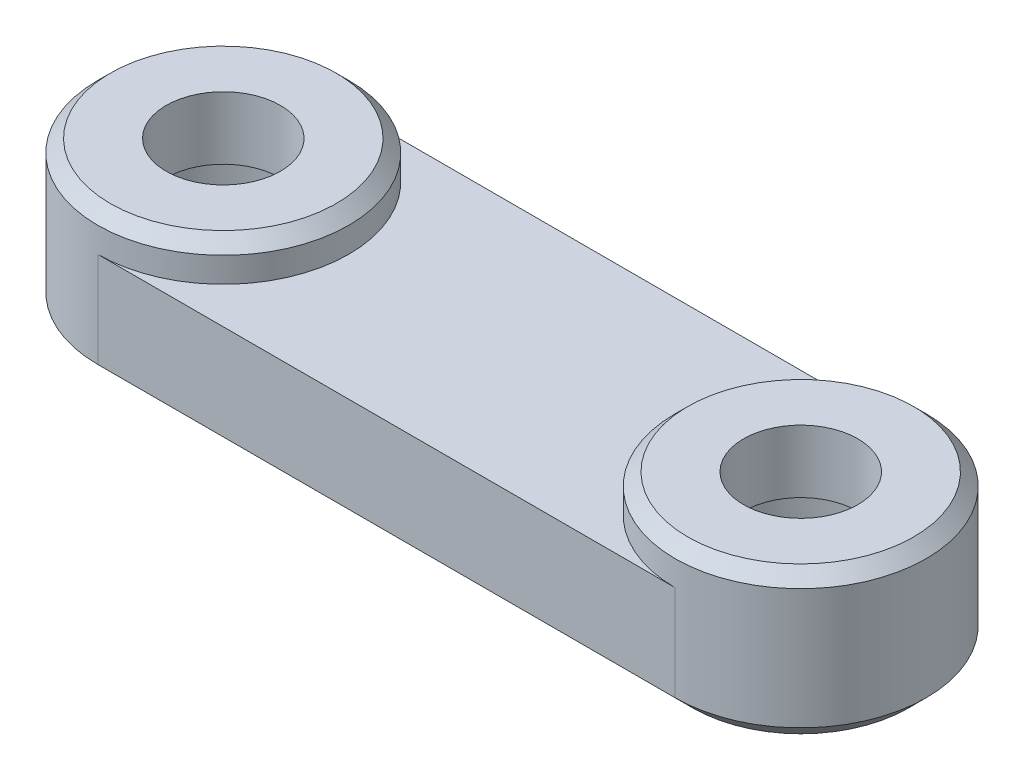
ISO-10303-21;
HEADER;
FILE_DESCRIPTION(('STEP AP214'),'2;1');
FILE_NAME('part.step','',(''),(''),'','','');
FILE_SCHEMA(('AUTOMOTIVE_DESIGN { 1 0 10303 214 1 1 1 1 }'));
ENDSEC;
DATA;
#1=APPLICATION_CONTEXT('core data for automotive mechanical design processes');
#2=APPLICATION_PROTOCOL_DEFINITION('international standard','automotive_design',2000,#1);
#3=PRODUCT_CONTEXT('',#1,'mechanical');
#4=PRODUCT('Part','Part','',(#3));
#5=PRODUCT_RELATED_PRODUCT_CATEGORY('part','',(#4));
#6=PRODUCT_DEFINITION_FORMATION('','',#4);
#7=PRODUCT_DEFINITION_CONTEXT('part definition',#1,'design');
#8=PRODUCT_DEFINITION('design','',#6,#7);
#9=PRODUCT_DEFINITION_SHAPE('','',#8);
#10=(LENGTH_UNIT() NAMED_UNIT(*) SI_UNIT(.MILLI.,.METRE.));
#11=(NAMED_UNIT(*) PLANE_ANGLE_UNIT() SI_UNIT($,.RADIAN.));
#12=(NAMED_UNIT(*) SI_UNIT($,.STERADIAN.) SOLID_ANGLE_UNIT());
#13=UNCERTAINTY_MEASURE_WITH_UNIT(LENGTH_MEASURE(1.E-05),#10,'distance_accuracy_value','');
#14=(GEOMETRIC_REPRESENTATION_CONTEXT(3) GLOBAL_UNCERTAINTY_ASSIGNED_CONTEXT((#13)) GLOBAL_UNIT_ASSIGNED_CONTEXT((#10,
#11,#12)) REPRESENTATION_CONTEXT('',''));
#15=CARTESIAN_POINT('',(0.,0.,0.));
#16=DIRECTION('',(0.,0.,1.));
#17=DIRECTION('',(1.,0.,0.));
#18=AXIS2_PLACEMENT_3D('',#15,#16,#17);
#19=CARTESIAN_POINT('',(0.,6.,0.));
#20=DIRECTION('',(0.,1.,0.));
#21=DIRECTION('',(0.,0.,1.));
#22=AXIS2_PLACEMENT_3D('',#19,#20,#21);
#23=PLANE('',#22);
#24=CARTESIAN_POINT('',(23.,6.,0.));
#25=DIRECTION('',(0.,1.,0.));
#26=DIRECTION('',(0.,0.,1.));
#27=AXIS2_PLACEMENT_3D('',#24,#25,#26);
#28=CIRCLE('',#27,4.5);
#29=CARTESIAN_POINT('',(23.,6.,4.5));
#30=VERTEX_POINT('',#29);
#31=EDGE_CURVE('E133',#30,#30,#28,.T.);
#32=ORIENTED_EDGE('',*,*,#31,.T.);
#33=EDGE_LOOP('',(#32));
#34=FACE_BOUND('',#33,.T.);
#35=CARTESIAN_POINT('',(23.,6.,0.));
#36=DIRECTION('',(0.,-1.,0.));
#37=DIRECTION('',(0.,0.,-1.));
#38=AXIS2_PLACEMENT_3D('',#35,#36,#37);
#39=CIRCLE('',#38,2.275);
#40=CARTESIAN_POINT('',(23.,6.,-2.275));
#41=VERTEX_POINT('',#40);
#42=EDGE_CURVE('E113',#41,#41,#39,.T.);
#43=ORIENTED_EDGE('',*,*,#42,.T.);
#44=EDGE_LOOP('',(#43));
#45=FACE_BOUND('',#44,.T.);
#46=ADVANCED_FACE('F41',(#34,#45),#23,.T.);
#47=CARTESIAN_POINT('',(0.,6.,0.));
#48=DIRECTION('',(0.,1.,0.));
#49=DIRECTION('',(0.,0.,1.));
#50=AXIS2_PLACEMENT_3D('',#47,#48,#49);
#51=CIRCLE('',#50,4.5);
#52=CARTESIAN_POINT('',(0.,6.,4.5));
#53=VERTEX_POINT('',#52);
#54=EDGE_CURVE('E120',#53,#53,#51,.T.);
#55=ORIENTED_EDGE('',*,*,#54,.T.);
#56=EDGE_LOOP('',(#55));
#57=FACE_BOUND('',#56,.T.);
#58=CARTESIAN_POINT('',(0.,6.,0.));
#59=DIRECTION('',(0.,-1.,0.));
#60=DIRECTION('',(0.,0.,-1.));
#61=AXIS2_PLACEMENT_3D('',#58,#59,#60);
#62=CIRCLE('',#61,2.275);
#63=CARTESIAN_POINT('',(0.,6.,-2.275));
#64=VERTEX_POINT('',#63);
#65=EDGE_CURVE('E213',#64,#64,#62,.T.);
#66=ORIENTED_EDGE('',*,*,#65,.T.);
#67=EDGE_LOOP('',(#66));
#68=FACE_BOUND('',#67,.T.);
#69=ADVANCED_FACE('F245',(#57,#68),#23,.T.);
#70=CARTESIAN_POINT('',(0.,6.,0.));
#71=DIRECTION('',(0.,-1.,0.));
#72=DIRECTION('',(0.,0.,-1.));
#73=AXIS2_PLACEMENT_3D('',#70,#71,#72);
#74=CYLINDRICAL_SURFACE('',#73,5.);
#75=CARTESIAN_POINT('',(0.,5.49999999999999,0.));
#76=DIRECTION('',(0.,1.,0.));
#77=DIRECTION('',(0.,0.,1.));
#78=AXIS2_PLACEMENT_3D('',#75,#76,#77);
#79=CIRCLE('',#78,5.);
#80=CARTESIAN_POINT('',(0.,5.49999999999999,5.));
#81=VERTEX_POINT('',#80);
#82=EDGE_CURVE('E129',#81,#81,#79,.F.);
#83=ORIENTED_EDGE('',*,*,#82,.T.);
#84=EDGE_LOOP('',(#83));
#85=FACE_BOUND('',#84,.T.);
#86=DIRECTION('',(0.,-1.,0.));
#87=VECTOR('',#86,1.);
#88=CARTESIAN_POINT('',(0.,6.,-5.));
#89=LINE('',#88,#87);
#90=CARTESIAN_POINT('',(0.,4.5,-5.00000000000926));
#91=VERTEX_POINT('',#90);
#92=CARTESIAN_POINT('',(0.,0.699999999999999,-5.));
#93=VERTEX_POINT('',#92);
#94=EDGE_CURVE('E195',#91,#93,#89,.T.);
#95=ORIENTED_EDGE('',*,*,#94,.T.);
#96=CARTESIAN_POINT('',(0.,0.699999999999999,0.));
#97=DIRECTION('',(0.,1.,0.));
#98=DIRECTION('',(0.,0.,1.));
#99=AXIS2_PLACEMENT_3D('',#96,#97,#98);
#100=CIRCLE('',#99,5.);
#101=CARTESIAN_POINT('',(0.,0.699999999999999,5.));
#102=VERTEX_POINT('',#101);
#103=EDGE_CURVE('E66',#93,#102,#100,.T.);
#104=ORIENTED_EDGE('',*,*,#103,.T.);
#105=DIRECTION('',(0.,-1.,0.));
#106=VECTOR('',#105,1.);
#107=CARTESIAN_POINT('',(0.,6.,5.));
#108=LINE('',#107,#106);
#109=CARTESIAN_POINT('',(0.,4.5,5.00000000000921));
#110=VERTEX_POINT('',#109);
#111=EDGE_CURVE('E110',#110,#102,#108,.T.);
#112=ORIENTED_EDGE('',*,*,#111,.F.);
#113=CARTESIAN_POINT('',(0.,4.5,0.));
#114=DIRECTION('',(0.,1.,0.));
#115=DIRECTION('',(0.,0.,1.));
#116=AXIS2_PLACEMENT_3D('',#113,#114,#115);
#117=CIRCLE('',#116,5.00000000000924);
#118=EDGE_CURVE('E98',#110,#91,#117,.T.);
#119=ORIENTED_EDGE('',*,*,#118,.T.);
#120=EDGE_LOOP('',(#95,#104,#112,#119));
#121=FACE_BOUND('',#120,.T.);
#122=ADVANCED_FACE('F115',(#85,#121),#74,.T.);
#123=CARTESIAN_POINT('',(0.,6.,5.));
#124=DIRECTION('',(0.,0.,-1.));
#125=DIRECTION('',(-1.,0.,0.));
#126=AXIS2_PLACEMENT_3D('',#123,#124,#125);
#127=PLANE('',#126);
#128=ORIENTED_EDGE('',*,*,#111,.T.);
#129=DIRECTION('',(1.,0.,0.));
#130=VECTOR('',#129,1.);
#131=CARTESIAN_POINT('',(0.,0.699999999999999,5.));
#132=LINE('',#131,#130);
#133=CARTESIAN_POINT('',(23.,0.699999999999999,5.));
#134=VERTEX_POINT('',#133);
#135=EDGE_CURVE('E11',#102,#134,#132,.T.);
#136=ORIENTED_EDGE('',*,*,#135,.T.);
#137=DIRECTION('',(0.,-1.,0.));
#138=VECTOR('',#137,1.);
#139=CARTESIAN_POINT('',(23.,6.,5.));
#140=LINE('',#139,#138);
#141=CARTESIAN_POINT('',(23.,4.5,4.99999999999672));
#142=VERTEX_POINT('',#141);
#143=EDGE_CURVE('E111',#142,#134,#140,.T.);
#144=ORIENTED_EDGE('',*,*,#143,.F.);
#145=DIRECTION('',(-1.,0.,0.));
#146=VECTOR('',#145,1.);
#147=CARTESIAN_POINT('',(0.,4.5,5.));
#148=LINE('',#147,#146);
#149=EDGE_CURVE('E101',#142,#110,#148,.T.);
#150=ORIENTED_EDGE('',*,*,#149,.T.);
#151=EDGE_LOOP('',(#128,#136,#144,#150));
#152=FACE_BOUND('',#151,.T.);
#153=ADVANCED_FACE('F109',(#152),#127,.F.);
#154=CARTESIAN_POINT('',(23.,6.,0.));
#155=DIRECTION('',(0.,-1.,0.));
#156=DIRECTION('',(0.,0.,-1.));
#157=AXIS2_PLACEMENT_3D('',#154,#155,#156);
#158=CYLINDRICAL_SURFACE('',#157,5.);
#159=CARTESIAN_POINT('',(23.,5.49999999999999,0.));
#160=DIRECTION('',(0.,1.,0.));
#161=DIRECTION('',(0.,0.,1.));
#162=AXIS2_PLACEMENT_3D('',#159,#160,#161);
#163=CIRCLE('',#162,5.);
#164=CARTESIAN_POINT('',(23.,5.49999999999999,5.));
#165=VERTEX_POINT('',#164);
#166=EDGE_CURVE('E137',#165,#165,#163,.F.);
#167=ORIENTED_EDGE('',*,*,#166,.T.);
#168=EDGE_LOOP('',(#167));
#169=FACE_BOUND('',#168,.T.);
#170=ORIENTED_EDGE('',*,*,#143,.T.);
#171=CARTESIAN_POINT('',(23.,0.699999999999999,0.));
#172=DIRECTION('',(0.,1.,0.));
#173=DIRECTION('',(0.,0.,1.));
#174=AXIS2_PLACEMENT_3D('',#171,#172,#173);
#175=CIRCLE('',#174,5.);
#176=CARTESIAN_POINT('',(23.,0.699999999999999,-5.));
#177=VERTEX_POINT('',#176);
#178=EDGE_CURVE('E52',#134,#177,#175,.T.);
#179=ORIENTED_EDGE('',*,*,#178,.T.);
#180=DIRECTION('',(0.,-1.,0.));
#181=VECTOR('',#180,1.);
#182=CARTESIAN_POINT('',(23.,6.,-5.));
#183=LINE('',#182,#181);
#184=CARTESIAN_POINT('',(23.,4.5,-4.99999999999672));
#185=VERTEX_POINT('',#184);
#186=EDGE_CURVE('E122',#185,#177,#183,.T.);
#187=ORIENTED_EDGE('',*,*,#186,.F.);
#188=CARTESIAN_POINT('',(23.,4.5,0.));
#189=DIRECTION('',(0.,1.,0.));
#190=DIRECTION('',(0.,0.,1.));
#191=AXIS2_PLACEMENT_3D('',#188,#189,#190);
#192=CIRCLE('',#191,4.99999999999672);
#193=EDGE_CURVE('E107',#185,#142,#192,.T.);
#194=ORIENTED_EDGE('',*,*,#193,.T.);
#195=EDGE_LOOP('',(#170,#179,#187,#194));
#196=FACE_BOUND('',#195,.T.);
#197=ADVANCED_FACE('F234',(#169,#196),#158,.T.);
#198=CARTESIAN_POINT('',(0.,6.,-5.));
#199=DIRECTION('',(0.,0.,1.));
#200=DIRECTION('',(1.,0.,0.));
#201=AXIS2_PLACEMENT_3D('',#198,#199,#200);
#202=PLANE('',#201);
#203=ORIENTED_EDGE('',*,*,#186,.T.);
#204=DIRECTION('',(-1.,0.,0.));
#205=VECTOR('',#204,1.);
#206=CARTESIAN_POINT('',(0.,0.699999999999999,-5.));
#207=LINE('',#206,#205);
#208=EDGE_CURVE('E141',#177,#93,#207,.T.);
#209=ORIENTED_EDGE('',*,*,#208,.T.);
#210=ORIENTED_EDGE('',*,*,#94,.F.);
#211=DIRECTION('',(1.,0.,0.));
#212=VECTOR('',#211,1.);
#213=CARTESIAN_POINT('',(0.,4.5,-5.));
#214=LINE('',#213,#212);
#215=EDGE_CURVE('E104',#91,#185,#214,.T.);
#216=ORIENTED_EDGE('',*,*,#215,.T.);
#217=EDGE_LOOP('',(#203,#209,#210,#216));
#218=FACE_BOUND('',#217,.T.);
#219=ADVANCED_FACE('F194',(#218),#202,.F.);
#220=CARTESIAN_POINT('',(0.,0.,0.));
#221=DIRECTION('',(0.,1.,0.));
#222=DIRECTION('',(0.,0.,1.));
#223=AXIS2_PLACEMENT_3D('',#220,#221,#222);
#224=PLANE('',#223);
#225=CARTESIAN_POINT('',(0.,0.,0.));
#226=DIRECTION('',(0.,1.,0.));
#227=DIRECTION('',(0.,0.,1.));
#228=AXIS2_PLACEMENT_3D('',#225,#226,#227);
#229=CIRCLE('',#228,4.29999999999999);
#230=CARTESIAN_POINT('',(0.,0.,4.29999999999999));
#231=VERTEX_POINT('',#230);
#232=CARTESIAN_POINT('',(0.,0.,-4.29999999999999));
#233=VERTEX_POINT('',#232);
#234=EDGE_CURVE('E151',#231,#233,#229,.F.);
#235=ORIENTED_EDGE('',*,*,#234,.T.);
#236=DIRECTION('',(1.,0.,0.));
#237=VECTOR('',#236,1.);
#238=CARTESIAN_POINT('',(0.,0.,-4.29999999999999));
#239=LINE('',#238,#237);
#240=CARTESIAN_POINT('',(23.,0.,-4.29999999999999));
#241=VERTEX_POINT('',#240);
#242=EDGE_CURVE('E154',#233,#241,#239,.T.);
#243=ORIENTED_EDGE('',*,*,#242,.T.);
#244=CARTESIAN_POINT('',(23.,0.,0.));
#245=DIRECTION('',(0.,1.,0.));
#246=DIRECTION('',(0.,0.,1.));
#247=AXIS2_PLACEMENT_3D('',#244,#245,#246);
#248=CIRCLE('',#247,4.29999999999999);
#249=CARTESIAN_POINT('',(23.,0.,4.29999999999999));
#250=VERTEX_POINT('',#249);
#251=EDGE_CURVE('E148',#241,#250,#248,.F.);
#252=ORIENTED_EDGE('',*,*,#251,.T.);
#253=DIRECTION('',(-1.,0.,0.));
#254=VECTOR('',#253,1.);
#255=CARTESIAN_POINT('',(0.,0.,4.29999999999999));
#256=LINE('',#255,#254);
#257=EDGE_CURVE('E145',#250,#231,#256,.T.);
#258=ORIENTED_EDGE('',*,*,#257,.T.);
#259=EDGE_LOOP('',(#235,#243,#252,#258));
#260=FACE_BOUND('',#259,.T.);
#261=CARTESIAN_POINT('',(23.,0.,0.));
#262=DIRECTION('',(0.,-1.,0.));
#263=DIRECTION('',(0.,0.,-1.));
#264=AXIS2_PLACEMENT_3D('',#261,#262,#263);
#265=CIRCLE('',#264,4.);
#266=CARTESIAN_POINT('',(23.,0.,-4.));
#267=VERTEX_POINT('',#266);
#268=EDGE_CURVE('E217',#267,#267,#265,.T.);
#269=ORIENTED_EDGE('',*,*,#268,.F.);
#270=EDGE_LOOP('',(#269));
#271=FACE_BOUND('',#270,.T.);
#272=CARTESIAN_POINT('',(0.,0.,0.));
#273=DIRECTION('',(0.,-1.,0.));
#274=DIRECTION('',(0.,0.,-1.));
#275=AXIS2_PLACEMENT_3D('',#272,#273,#274);
#276=CIRCLE('',#275,4.);
#277=CARTESIAN_POINT('',(0.,0.,-4.));
#278=VERTEX_POINT('',#277);
#279=EDGE_CURVE('E198',#278,#278,#276,.T.);
#280=ORIENTED_EDGE('',*,*,#279,.F.);
#281=EDGE_LOOP('',(#280));
#282=FACE_BOUND('',#281,.T.);
#283=ADVANCED_FACE('F184',(#260,#271,#282),#224,.F.);
#284=CARTESIAN_POINT('',(0.,0.,0.));
#285=DIRECTION('',(0.,-1.,0.));
#286=DIRECTION('',(0.,0.,-1.));
#287=AXIS2_PLACEMENT_3D('',#284,#285,#286);
#288=CYLINDRICAL_SURFACE('',#287,4.);
#289=ORIENTED_EDGE('',*,*,#279,.T.);
#290=EDGE_LOOP('',(#289));
#291=FACE_BOUND('',#290,.T.);
#292=CARTESIAN_POINT('',(0.,3.5,0.));
#293=DIRECTION('',(0.,-1.,0.));
#294=DIRECTION('',(0.,0.,-1.));
#295=AXIS2_PLACEMENT_3D('',#292,#293,#294);
#296=CIRCLE('',#295,4.);
#297=CARTESIAN_POINT('',(0.,3.5,-4.));
#298=VERTEX_POINT('',#297);
#299=EDGE_CURVE('E203',#298,#298,#296,.T.);
#300=ORIENTED_EDGE('',*,*,#299,.F.);
#301=EDGE_LOOP('',(#300));
#302=FACE_BOUND('',#301,.T.);
#303=ADVANCED_FACE('F255',(#291,#302),#288,.F.);
#304=CARTESIAN_POINT('',(-4.,3.5,0.));
#305=DIRECTION('',(0.,-1.,0.));
#306=DIRECTION('',(0.,0.,-1.));
#307=AXIS2_PLACEMENT_3D('',#304,#305,#306);
#308=PLANE('',#307);
#309=ORIENTED_EDGE('',*,*,#299,.T.);
#310=EDGE_LOOP('',(#309));
#311=FACE_BOUND('',#310,.T.);
#312=CARTESIAN_POINT('',(0.,3.5,0.));
#313=DIRECTION('',(0.,-1.,0.));
#314=DIRECTION('',(0.,0.,-1.));
#315=AXIS2_PLACEMENT_3D('',#312,#313,#314);
#316=CIRCLE('',#315,2.275);
#317=CARTESIAN_POINT('',(0.,3.5,-2.275));
#318=VERTEX_POINT('',#317);
#319=EDGE_CURVE('E209',#318,#318,#316,.T.);
#320=ORIENTED_EDGE('',*,*,#319,.F.);
#321=EDGE_LOOP('',(#320));
#322=FACE_BOUND('',#321,.T.);
#323=ADVANCED_FACE('F261',(#311,#322),#308,.T.);
#324=CARTESIAN_POINT('',(0.,0.,0.));
#325=DIRECTION('',(0.,-1.,0.));
#326=DIRECTION('',(0.,0.,-1.));
#327=AXIS2_PLACEMENT_3D('',#324,#325,#326);
#328=CYLINDRICAL_SURFACE('',#327,2.275);
#329=ORIENTED_EDGE('',*,*,#319,.T.);
#330=EDGE_LOOP('',(#329));
#331=FACE_BOUND('',#330,.T.);
#332=ORIENTED_EDGE('',*,*,#65,.F.);
#333=EDGE_LOOP('',(#332));
#334=FACE_BOUND('',#333,.T.);
#335=ADVANCED_FACE('F266',(#331,#334),#328,.F.);
#336=CARTESIAN_POINT('',(23.,0.,0.));
#337=DIRECTION('',(0.,-1.,0.));
#338=DIRECTION('',(0.,0.,-1.));
#339=AXIS2_PLACEMENT_3D('',#336,#337,#338);
#340=CYLINDRICAL_SURFACE('',#339,4.);
#341=ORIENTED_EDGE('',*,*,#268,.T.);
#342=EDGE_LOOP('',(#341));
#343=FACE_BOUND('',#342,.T.);
#344=CARTESIAN_POINT('',(23.,3.5,0.));
#345=DIRECTION('',(0.,-1.,0.));
#346=DIRECTION('',(0.,0.,-1.));
#347=AXIS2_PLACEMENT_3D('',#344,#345,#346);
#348=CIRCLE('',#347,4.);
#349=CARTESIAN_POINT('',(23.,3.5,-4.));
#350=VERTEX_POINT('',#349);
#351=EDGE_CURVE('E221',#350,#350,#348,.T.);
#352=ORIENTED_EDGE('',*,*,#351,.F.);
#353=EDGE_LOOP('',(#352));
#354=FACE_BOUND('',#353,.T.);
#355=ADVANCED_FACE('F276',(#343,#354),#340,.F.);
#356=CARTESIAN_POINT('',(19.,3.5,0.));
#357=DIRECTION('',(0.,-1.,0.));
#358=DIRECTION('',(0.,0.,-1.));
#359=AXIS2_PLACEMENT_3D('',#356,#357,#358);
#360=PLANE('',#359);
#361=ORIENTED_EDGE('',*,*,#351,.T.);
#362=EDGE_LOOP('',(#361));
#363=FACE_BOUND('',#362,.T.);
#364=CARTESIAN_POINT('',(23.,3.5,0.));
#365=DIRECTION('',(0.,-1.,0.));
#366=DIRECTION('',(0.,0.,-1.));
#367=AXIS2_PLACEMENT_3D('',#364,#365,#366);
#368=CIRCLE('',#367,2.275);
#369=CARTESIAN_POINT('',(23.,3.5,-2.275));
#370=VERTEX_POINT('',#369);
#371=EDGE_CURVE('E225',#370,#370,#368,.T.);
#372=ORIENTED_EDGE('',*,*,#371,.F.);
#373=EDGE_LOOP('',(#372));
#374=FACE_BOUND('',#373,.T.);
#375=ADVANCED_FACE('F283',(#363,#374),#360,.T.);
#376=CARTESIAN_POINT('',(23.,0.,0.));
#377=DIRECTION('',(0.,-1.,0.));
#378=DIRECTION('',(0.,0.,-1.));
#379=AXIS2_PLACEMENT_3D('',#376,#377,#378);
#380=CYLINDRICAL_SURFACE('',#379,2.275);
#381=ORIENTED_EDGE('',*,*,#371,.T.);
#382=EDGE_LOOP('',(#381));
#383=FACE_BOUND('',#382,.T.);
#384=ORIENTED_EDGE('',*,*,#42,.F.);
#385=EDGE_LOOP('',(#384));
#386=FACE_BOUND('',#385,.T.);
#387=ADVANCED_FACE('F289',(#383,#386),#380,.F.);
#388=CARTESIAN_POINT('',(0.,4.5,0.));
#389=DIRECTION('',(0.,-1.,0.));
#390=DIRECTION('',(0.,0.,-1.));
#391=AXIS2_PLACEMENT_3D('',#388,#389,#390);
#392=PLANE('',#391);
#393=ORIENTED_EDGE('',*,*,#193,.F.);
#394=ORIENTED_EDGE('',*,*,#215,.F.);
#395=ORIENTED_EDGE('',*,*,#118,.F.);
#396=ORIENTED_EDGE('',*,*,#149,.F.);
#397=EDGE_LOOP('',(#393,#394,#395,#396));
#398=FACE_BOUND('',#397,.T.);
#399=ADVANCED_FACE('F100',(#398),#392,.F.);
#400=CARTESIAN_POINT('',(0.,6.,0.));
#401=DIRECTION('',(0.,-1.,0.));
#402=DIRECTION('',(0.,0.,-1.));
#403=AXIS2_PLACEMENT_3D('',#400,#401,#402);
#404=CONICAL_SURFACE('',#403,4.5,0.785398163397445);
#405=ORIENTED_EDGE('',*,*,#82,.F.);
#406=EDGE_LOOP('',(#405));
#407=FACE_BOUND('',#406,.T.);
#408=ORIENTED_EDGE('',*,*,#54,.F.);
#409=EDGE_LOOP('',(#408));
#410=FACE_BOUND('',#409,.T.);
#411=ADVANCED_FACE('F295',(#407,#410),#404,.T.);
#412=CARTESIAN_POINT('',(23.,6.,0.));
#413=DIRECTION('',(0.,-1.,0.));
#414=DIRECTION('',(0.,0.,-1.));
#415=AXIS2_PLACEMENT_3D('',#412,#413,#414);
#416=CONICAL_SURFACE('',#415,4.5,0.785398163397445);
#417=ORIENTED_EDGE('',*,*,#166,.F.);
#418=EDGE_LOOP('',(#417));
#419=FACE_BOUND('',#418,.T.);
#420=ORIENTED_EDGE('',*,*,#31,.F.);
#421=EDGE_LOOP('',(#420));
#422=FACE_BOUND('',#421,.T.);
#423=ADVANCED_FACE('F299',(#419,#422),#416,.T.);
#424=CARTESIAN_POINT('',(0.,0.699999999999999,5.));
#425=DIRECTION('',(0.,0.707106781186551,-0.707106781186544));
#426=DIRECTION('',(1.,0.,0.));
#427=AXIS2_PLACEMENT_3D('',#424,#425,#426);
#428=PLANE('',#427);
#429=DIRECTION('',(0.,0.707106781186544,0.707106781186551));
#430=VECTOR('',#429,1.);
#431=CARTESIAN_POINT('',(0.,0.,4.29999999999999));
#432=LINE('',#431,#430);
#433=EDGE_CURVE('E167',#231,#102,#432,.T.);
#434=ORIENTED_EDGE('',*,*,#433,.F.);
#435=ORIENTED_EDGE('',*,*,#257,.F.);
#436=DIRECTION('',(0.,-0.707106781186544,-0.707106781186551));
#437=VECTOR('',#436,1.);
#438=CARTESIAN_POINT('',(23.,0.699999999999999,5.));
#439=LINE('',#438,#437);
#440=EDGE_CURVE('E46',#134,#250,#439,.T.);
#441=ORIENTED_EDGE('',*,*,#440,.F.);
#442=ORIENTED_EDGE('',*,*,#135,.F.);
#443=EDGE_LOOP('',(#434,#435,#441,#442));
#444=FACE_BOUND('',#443,.T.);
#445=ADVANCED_FACE('F44',(#444),#428,.F.);
#446=CARTESIAN_POINT('',(23.,0.699999999999999,0.));
#447=DIRECTION('',(0.,1.,0.));
#448=DIRECTION('',(0.,0.,1.));
#449=AXIS2_PLACEMENT_3D('',#446,#447,#448);
#450=CONICAL_SURFACE('',#449,5.,0.785398163397453);
#451=ORIENTED_EDGE('',*,*,#440,.T.);
#452=ORIENTED_EDGE('',*,*,#251,.F.);
#453=DIRECTION('',(0.,-0.707106781186544,0.707106781186551));
#454=VECTOR('',#453,1.);
#455=CARTESIAN_POINT('',(23.,0.699999999999999,-5.));
#456=LINE('',#455,#454);
#457=EDGE_CURVE('E165',#177,#241,#456,.T.);
#458=ORIENTED_EDGE('',*,*,#457,.F.);
#459=ORIENTED_EDGE('',*,*,#178,.F.);
#460=EDGE_LOOP('',(#451,#452,#458,#459));
#461=FACE_BOUND('',#460,.T.);
#462=ADVANCED_FACE('F179',(#461),#450,.T.);
#463=CARTESIAN_POINT('',(0.,0.699999999999999,0.));
#464=DIRECTION('',(0.,1.,0.));
#465=DIRECTION('',(0.,0.,1.));
#466=AXIS2_PLACEMENT_3D('',#463,#464,#465);
#467=CONICAL_SURFACE('',#466,5.,0.785398163397453);
#468=ORIENTED_EDGE('',*,*,#433,.T.);
#469=ORIENTED_EDGE('',*,*,#103,.F.);
#470=DIRECTION('',(0.,0.707106781186544,-0.707106781186551));
#471=VECTOR('',#470,1.);
#472=CARTESIAN_POINT('',(0.,0.,-4.29999999999999));
#473=LINE('',#472,#471);
#474=EDGE_CURVE('E162',#233,#93,#473,.T.);
#475=ORIENTED_EDGE('',*,*,#474,.F.);
#476=ORIENTED_EDGE('',*,*,#234,.F.);
#477=EDGE_LOOP('',(#468,#469,#475,#476));
#478=FACE_BOUND('',#477,.T.);
#479=ADVANCED_FACE('F191',(#478),#467,.T.);
#480=CARTESIAN_POINT('',(0.,0.699999999999999,-5.));
#481=DIRECTION('',(0.,0.707106781186551,0.707106781186544));
#482=DIRECTION('',(-1.,0.,0.));
#483=AXIS2_PLACEMENT_3D('',#480,#481,#482);
#484=PLANE('',#483);
#485=ORIENTED_EDGE('',*,*,#457,.T.);
#486=ORIENTED_EDGE('',*,*,#242,.F.);
#487=ORIENTED_EDGE('',*,*,#474,.T.);
#488=ORIENTED_EDGE('',*,*,#208,.F.);
#489=EDGE_LOOP('',(#485,#486,#487,#488));
#490=FACE_BOUND('',#489,.T.);
#491=ADVANCED_FACE('F189',(#490),#484,.F.);
#492=CLOSED_SHELL('',(#46,#69,#122,#153,#197,#219,#283,#303,#323,#335,#355,#375,#387,#399,#411,
#423,#445,#462,#479,#491));
#493=MANIFOLD_SOLID_BREP('B2',#492);
#494=ADVANCED_BREP_SHAPE_REPRESENTATION('',(#18,#493),#14);
#495=SHAPE_DEFINITION_REPRESENTATION(#9,#494);
ENDSEC;
END-ISO-10303-21;
